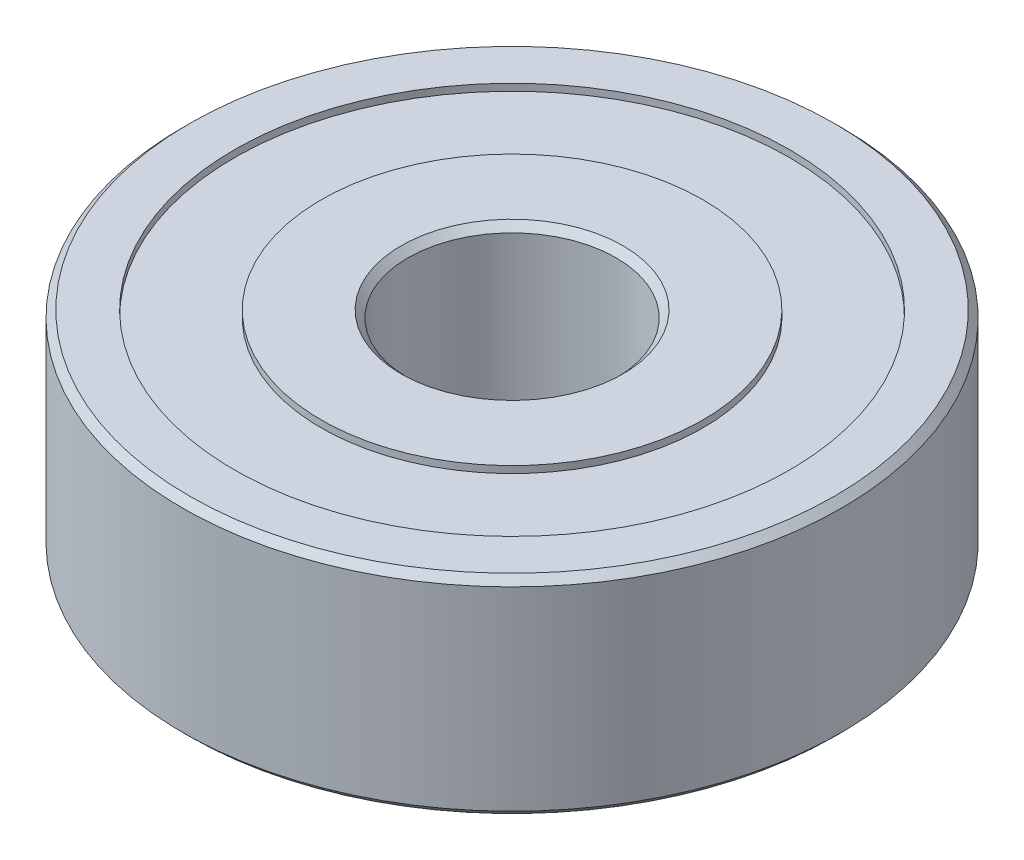
ISO-10303-21;
HEADER;
FILE_DESCRIPTION(('STEP AP214'),'2;1');
FILE_NAME('part.step','',(''),(''),'','','');
FILE_SCHEMA(('AUTOMOTIVE_DESIGN { 1 0 10303 214 1 1 1 1 }'));
ENDSEC;
DATA;
#1=APPLICATION_CONTEXT('core data for automotive mechanical design processes');
#2=APPLICATION_PROTOCOL_DEFINITION('international standard','automotive_design',2000,#1);
#3=PRODUCT_CONTEXT('',#1,'mechanical');
#4=PRODUCT('Part','Part','',(#3));
#5=PRODUCT_RELATED_PRODUCT_CATEGORY('part','',(#4));
#6=PRODUCT_DEFINITION_FORMATION('','',#4);
#7=PRODUCT_DEFINITION_CONTEXT('part definition',#1,'design');
#8=PRODUCT_DEFINITION('design','',#6,#7);
#9=PRODUCT_DEFINITION_SHAPE('','',#8);
#10=(LENGTH_UNIT() NAMED_UNIT(*) SI_UNIT(.MILLI.,.METRE.));
#11=(NAMED_UNIT(*) PLANE_ANGLE_UNIT() SI_UNIT($,.RADIAN.));
#12=(NAMED_UNIT(*) SI_UNIT($,.STERADIAN.) SOLID_ANGLE_UNIT());
#13=UNCERTAINTY_MEASURE_WITH_UNIT(LENGTH_MEASURE(1.E-05),#10,'distance_accuracy_value','');
#14=(GEOMETRIC_REPRESENTATION_CONTEXT(3) GLOBAL_UNCERTAINTY_ASSIGNED_CONTEXT((#13)) GLOBAL_UNIT_ASSIGNED_CONTEXT((#10,
#11,#12)) REPRESENTATION_CONTEXT('',''));
#15=CARTESIAN_POINT('',(0.,0.,0.));
#16=DIRECTION('',(0.,0.,1.));
#17=DIRECTION('',(1.,0.,0.));
#18=AXIS2_PLACEMENT_3D('',#15,#16,#17);
#19=CARTESIAN_POINT('',(0.,6.,0.));
#20=DIRECTION('',(0.,-1.,0.));
#21=DIRECTION('',(0.,0.,-1.));
#22=AXIS2_PLACEMENT_3D('',#19,#20,#21);
#23=CYLINDRICAL_SURFACE('',#22,9.49999999999999);
#24=CARTESIAN_POINT('',(0.,5.8,0.));
#25=DIRECTION('',(0.,-1.,0.));
#26=DIRECTION('',(0.,0.,-1.));
#27=AXIS2_PLACEMENT_3D('',#24,#25,#26);
#28=CIRCLE('',#27,9.49999999999999);
#29=CARTESIAN_POINT('',(0.,5.8,-9.49999999999999));
#30=VERTEX_POINT('',#29);
#31=EDGE_CURVE('E10',#30,#30,#28,.T.);
#32=ORIENTED_EDGE('',*,*,#31,.T.);
#33=EDGE_LOOP('',(#32));
#34=FACE_BOUND('',#33,.T.);
#35=CARTESIAN_POINT('',(0.,0.200000000000004,0.));
#36=DIRECTION('',(0.,-1.,0.));
#37=DIRECTION('',(0.,0.,-1.));
#38=AXIS2_PLACEMENT_3D('',#35,#36,#37);
#39=CIRCLE('',#38,9.5);
#40=CARTESIAN_POINT('',(0.,0.200000000000004,-9.5));
#41=VERTEX_POINT('',#40);
#42=EDGE_CURVE('E83',#41,#41,#39,.T.);
#43=ORIENTED_EDGE('',*,*,#42,.F.);
#44=EDGE_LOOP('',(#43));
#45=FACE_BOUND('',#44,.T.);
#46=ADVANCED_FACE('F31',(#34,#45),#23,.T.);
#47=CARTESIAN_POINT('',(0.,5.8,0.));
#48=DIRECTION('',(0.,-1.,0.));
#49=DIRECTION('',(0.,0.,-1.));
#50=AXIS2_PLACEMENT_3D('',#47,#48,#49);
#51=CONICAL_SURFACE('',#50,9.49999999999999,0.785398163397418);
#52=CARTESIAN_POINT('',(0.,6.,0.));
#53=DIRECTION('',(0.,-1.,0.));
#54=DIRECTION('',(0.,0.,-1.));
#55=AXIS2_PLACEMENT_3D('',#52,#53,#54);
#56=CIRCLE('',#55,9.3);
#57=CARTESIAN_POINT('',(0.,6.,-9.3));
#58=VERTEX_POINT('',#57);
#59=EDGE_CURVE('E37',#58,#58,#56,.T.);
#60=ORIENTED_EDGE('',*,*,#59,.T.);
#61=EDGE_LOOP('',(#60));
#62=FACE_BOUND('',#61,.T.);
#63=ORIENTED_EDGE('',*,*,#31,.F.);
#64=EDGE_LOOP('',(#63));
#65=FACE_BOUND('',#64,.T.);
#66=ADVANCED_FACE('F91',(#62,#65),#51,.T.);
#67=CARTESIAN_POINT('',(9.3,6.,0.));
#68=DIRECTION('',(0.,1.,0.));
#69=DIRECTION('',(0.,0.,1.));
#70=AXIS2_PLACEMENT_3D('',#67,#68,#69);
#71=PLANE('',#70);
#72=CARTESIAN_POINT('',(0.,6.,0.));
#73=DIRECTION('',(0.,-1.,0.));
#74=DIRECTION('',(0.,0.,-1.));
#75=AXIS2_PLACEMENT_3D('',#72,#73,#74);
#76=CIRCLE('',#75,8.);
#77=CARTESIAN_POINT('',(0.,6.,-8.));
#78=VERTEX_POINT('',#77);
#79=EDGE_CURVE('E41',#78,#78,#76,.T.);
#80=ORIENTED_EDGE('',*,*,#79,.T.);
#81=EDGE_LOOP('',(#80));
#82=FACE_BOUND('',#81,.T.);
#83=ORIENTED_EDGE('',*,*,#59,.F.);
#84=EDGE_LOOP('',(#83));
#85=FACE_BOUND('',#84,.T.);
#86=ADVANCED_FACE('F95',(#82,#85),#71,.T.);
#87=CARTESIAN_POINT('',(0.,6.,0.));
#88=DIRECTION('',(0.,-1.,0.));
#89=DIRECTION('',(0.,0.,-1.));
#90=AXIS2_PLACEMENT_3D('',#87,#88,#89);
#91=CYLINDRICAL_SURFACE('',#90,8.);
#92=CARTESIAN_POINT('',(0.,5.8,0.));
#93=DIRECTION('',(0.,-1.,0.));
#94=DIRECTION('',(0.,0.,-1.));
#95=AXIS2_PLACEMENT_3D('',#92,#93,#94);
#96=CIRCLE('',#95,8.);
#97=CARTESIAN_POINT('',(0.,5.8,-8.));
#98=VERTEX_POINT('',#97);
#99=EDGE_CURVE('E45',#98,#98,#96,.T.);
#100=ORIENTED_EDGE('',*,*,#99,.T.);
#101=EDGE_LOOP('',(#100));
#102=FACE_BOUND('',#101,.T.);
#103=ORIENTED_EDGE('',*,*,#79,.F.);
#104=EDGE_LOOP('',(#103));
#105=FACE_BOUND('',#104,.T.);
#106=ADVANCED_FACE('F99',(#102,#105),#91,.F.);
#107=CARTESIAN_POINT('',(8.,5.8,0.));
#108=DIRECTION('',(0.,1.,0.));
#109=DIRECTION('',(0.,0.,1.));
#110=AXIS2_PLACEMENT_3D('',#107,#108,#109);
#111=PLANE('',#110);
#112=CARTESIAN_POINT('',(0.,5.8,0.));
#113=DIRECTION('',(0.,-1.,0.));
#114=DIRECTION('',(0.,0.,-1.));
#115=AXIS2_PLACEMENT_3D('',#112,#113,#114);
#116=CIRCLE('',#115,5.5);
#117=CARTESIAN_POINT('',(0.,5.8,-5.5));
#118=VERTEX_POINT('',#117);
#119=EDGE_CURVE('E50',#118,#118,#116,.T.);
#120=ORIENTED_EDGE('',*,*,#119,.T.);
#121=EDGE_LOOP('',(#120));
#122=FACE_BOUND('',#121,.T.);
#123=ORIENTED_EDGE('',*,*,#99,.F.);
#124=EDGE_LOOP('',(#123));
#125=FACE_BOUND('',#124,.T.);
#126=ADVANCED_FACE('F106',(#122,#125),#111,.T.);
#127=CARTESIAN_POINT('',(0.,6.,0.));
#128=DIRECTION('',(0.,-1.,0.));
#129=DIRECTION('',(0.,0.,-1.));
#130=AXIS2_PLACEMENT_3D('',#127,#128,#129);
#131=CYLINDRICAL_SURFACE('',#130,5.5);
#132=CARTESIAN_POINT('',(0.,6.,0.));
#133=DIRECTION('',(0.,-1.,0.));
#134=DIRECTION('',(0.,0.,-1.));
#135=AXIS2_PLACEMENT_3D('',#132,#133,#134);
#136=CIRCLE('',#135,5.5);
#137=CARTESIAN_POINT('',(0.,6.,-5.5));
#138=VERTEX_POINT('',#137);
#139=EDGE_CURVE('E53',#138,#138,#136,.T.);
#140=ORIENTED_EDGE('',*,*,#139,.T.);
#141=EDGE_LOOP('',(#140));
#142=FACE_BOUND('',#141,.T.);
#143=ORIENTED_EDGE('',*,*,#119,.F.);
#144=EDGE_LOOP('',(#143));
#145=FACE_BOUND('',#144,.T.);
#146=ADVANCED_FACE('F110',(#142,#145),#131,.T.);
#147=CARTESIAN_POINT('',(5.5,6.,0.));
#148=DIRECTION('',(0.,1.,0.));
#149=DIRECTION('',(0.,0.,1.));
#150=AXIS2_PLACEMENT_3D('',#147,#148,#149);
#151=PLANE('',#150);
#152=CARTESIAN_POINT('',(0.,6.,0.));
#153=DIRECTION('',(0.,-1.,0.));
#154=DIRECTION('',(0.,0.,-1.));
#155=AXIS2_PLACEMENT_3D('',#152,#153,#154);
#156=CIRCLE('',#155,3.2);
#157=CARTESIAN_POINT('',(0.,6.,-3.2));
#158=VERTEX_POINT('',#157);
#159=EDGE_CURVE('E56',#158,#158,#156,.T.);
#160=ORIENTED_EDGE('',*,*,#159,.T.);
#161=EDGE_LOOP('',(#160));
#162=FACE_BOUND('',#161,.T.);
#163=ORIENTED_EDGE('',*,*,#139,.F.);
#164=EDGE_LOOP('',(#163));
#165=FACE_BOUND('',#164,.T.);
#166=ADVANCED_FACE('F114',(#162,#165),#151,.T.);
#167=CARTESIAN_POINT('',(0.,6.,0.));
#168=DIRECTION('',(0.,1.,0.));
#169=DIRECTION('',(0.,0.,1.));
#170=AXIS2_PLACEMENT_3D('',#167,#168,#169);
#171=CONICAL_SURFACE('',#170,3.2,0.785398163397449);
#172=CARTESIAN_POINT('',(0.,5.8,0.));
#173=DIRECTION('',(0.,-1.,0.));
#174=DIRECTION('',(0.,0.,-1.));
#175=AXIS2_PLACEMENT_3D('',#172,#173,#174);
#176=CIRCLE('',#175,3.);
#177=CARTESIAN_POINT('',(0.,5.8,-3.));
#178=VERTEX_POINT('',#177);
#179=EDGE_CURVE('E59',#178,#178,#176,.T.);
#180=ORIENTED_EDGE('',*,*,#179,.T.);
#181=EDGE_LOOP('',(#180));
#182=FACE_BOUND('',#181,.T.);
#183=ORIENTED_EDGE('',*,*,#159,.F.);
#184=EDGE_LOOP('',(#183));
#185=FACE_BOUND('',#184,.T.);
#186=ADVANCED_FACE('F118',(#182,#185),#171,.F.);
#187=CARTESIAN_POINT('',(0.,6.,0.));
#188=DIRECTION('',(0.,-1.,0.));
#189=DIRECTION('',(0.,0.,-1.));
#190=AXIS2_PLACEMENT_3D('',#187,#188,#189);
#191=CYLINDRICAL_SURFACE('',#190,3.);
#192=CARTESIAN_POINT('',(0.,0.2,0.));
#193=DIRECTION('',(0.,-1.,0.));
#194=DIRECTION('',(0.,0.,-1.));
#195=AXIS2_PLACEMENT_3D('',#192,#193,#194);
#196=CIRCLE('',#195,3.);
#197=CARTESIAN_POINT('',(0.,0.2,-3.));
#198=VERTEX_POINT('',#197);
#199=EDGE_CURVE('E62',#198,#198,#196,.T.);
#200=ORIENTED_EDGE('',*,*,#199,.T.);
#201=EDGE_LOOP('',(#200));
#202=FACE_BOUND('',#201,.T.);
#203=ORIENTED_EDGE('',*,*,#179,.F.);
#204=EDGE_LOOP('',(#203));
#205=FACE_BOUND('',#204,.T.);
#206=ADVANCED_FACE('F122',(#202,#205),#191,.F.);
#207=CARTESIAN_POINT('',(0.,0.2,0.));
#208=DIRECTION('',(0.,-1.,0.));
#209=DIRECTION('',(0.,0.,-1.));
#210=AXIS2_PLACEMENT_3D('',#207,#208,#209);
#211=CONICAL_SURFACE('',#210,3.,0.78539816339745);
#212=CARTESIAN_POINT('',(0.,0.,0.));
#213=DIRECTION('',(0.,-1.,0.));
#214=DIRECTION('',(0.,0.,-1.));
#215=AXIS2_PLACEMENT_3D('',#212,#213,#214);
#216=CIRCLE('',#215,3.2);
#217=CARTESIAN_POINT('',(0.,0.,-3.2));
#218=VERTEX_POINT('',#217);
#219=EDGE_CURVE('E65',#218,#218,#216,.T.);
#220=ORIENTED_EDGE('',*,*,#219,.T.);
#221=EDGE_LOOP('',(#220));
#222=FACE_BOUND('',#221,.T.);
#223=ORIENTED_EDGE('',*,*,#199,.F.);
#224=EDGE_LOOP('',(#223));
#225=FACE_BOUND('',#224,.T.);
#226=ADVANCED_FACE('F126',(#222,#225),#211,.F.);
#227=CARTESIAN_POINT('',(3.2,0.,0.));
#228=DIRECTION('',(0.,-1.,0.));
#229=DIRECTION('',(0.,0.,-1.));
#230=AXIS2_PLACEMENT_3D('',#227,#228,#229);
#231=PLANE('',#230);
#232=CARTESIAN_POINT('',(0.,0.,0.));
#233=DIRECTION('',(0.,-1.,0.));
#234=DIRECTION('',(0.,0.,-1.));
#235=AXIS2_PLACEMENT_3D('',#232,#233,#234);
#236=CIRCLE('',#235,5.5);
#237=CARTESIAN_POINT('',(0.,0.,-5.5));
#238=VERTEX_POINT('',#237);
#239=EDGE_CURVE('E68',#238,#238,#236,.T.);
#240=ORIENTED_EDGE('',*,*,#239,.T.);
#241=EDGE_LOOP('',(#240));
#242=FACE_BOUND('',#241,.T.);
#243=ORIENTED_EDGE('',*,*,#219,.F.);
#244=EDGE_LOOP('',(#243));
#245=FACE_BOUND('',#244,.T.);
#246=ADVANCED_FACE('F130',(#242,#245),#231,.T.);
#247=CARTESIAN_POINT('',(0.,6.,0.));
#248=DIRECTION('',(0.,-1.,0.));
#249=DIRECTION('',(0.,0.,-1.));
#250=AXIS2_PLACEMENT_3D('',#247,#248,#249);
#251=CYLINDRICAL_SURFACE('',#250,5.5);
#252=CARTESIAN_POINT('',(0.,0.2,0.));
#253=DIRECTION('',(0.,-1.,0.));
#254=DIRECTION('',(0.,0.,-1.));
#255=AXIS2_PLACEMENT_3D('',#252,#253,#254);
#256=CIRCLE('',#255,5.5);
#257=CARTESIAN_POINT('',(0.,0.2,-5.5));
#258=VERTEX_POINT('',#257);
#259=EDGE_CURVE('E71',#258,#258,#256,.T.);
#260=ORIENTED_EDGE('',*,*,#259,.T.);
#261=EDGE_LOOP('',(#260));
#262=FACE_BOUND('',#261,.T.);
#263=ORIENTED_EDGE('',*,*,#239,.F.);
#264=EDGE_LOOP('',(#263));
#265=FACE_BOUND('',#264,.T.);
#266=ADVANCED_FACE('F134',(#262,#265),#251,.T.);
#267=CARTESIAN_POINT('',(5.5,0.2,0.));
#268=DIRECTION('',(0.,-1.,0.));
#269=DIRECTION('',(0.,0.,-1.));
#270=AXIS2_PLACEMENT_3D('',#267,#268,#269);
#271=PLANE('',#270);
#272=CARTESIAN_POINT('',(0.,0.2,0.));
#273=DIRECTION('',(0.,-1.,0.));
#274=DIRECTION('',(0.,0.,-1.));
#275=AXIS2_PLACEMENT_3D('',#272,#273,#274);
#276=CIRCLE('',#275,8.);
#277=CARTESIAN_POINT('',(0.,0.2,-8.));
#278=VERTEX_POINT('',#277);
#279=EDGE_CURVE('E74',#278,#278,#276,.T.);
#280=ORIENTED_EDGE('',*,*,#279,.T.);
#281=EDGE_LOOP('',(#280));
#282=FACE_BOUND('',#281,.T.);
#283=ORIENTED_EDGE('',*,*,#259,.F.);
#284=EDGE_LOOP('',(#283));
#285=FACE_BOUND('',#284,.T.);
#286=ADVANCED_FACE('F138',(#282,#285),#271,.T.);
#287=CARTESIAN_POINT('',(0.,6.,0.));
#288=DIRECTION('',(0.,-1.,0.));
#289=DIRECTION('',(0.,0.,-1.));
#290=AXIS2_PLACEMENT_3D('',#287,#288,#289);
#291=CYLINDRICAL_SURFACE('',#290,8.);
#292=CARTESIAN_POINT('',(0.,0.,0.));
#293=DIRECTION('',(0.,-1.,0.));
#294=DIRECTION('',(0.,0.,-1.));
#295=AXIS2_PLACEMENT_3D('',#292,#293,#294);
#296=CIRCLE('',#295,8.);
#297=CARTESIAN_POINT('',(0.,0.,-8.));
#298=VERTEX_POINT('',#297);
#299=EDGE_CURVE('E77',#298,#298,#296,.T.);
#300=ORIENTED_EDGE('',*,*,#299,.T.);
#301=EDGE_LOOP('',(#300));
#302=FACE_BOUND('',#301,.T.);
#303=ORIENTED_EDGE('',*,*,#279,.F.);
#304=EDGE_LOOP('',(#303));
#305=FACE_BOUND('',#304,.T.);
#306=ADVANCED_FACE('F142',(#302,#305),#291,.F.);
#307=CARTESIAN_POINT('',(8.,0.,0.));
#308=DIRECTION('',(0.,-1.,0.));
#309=DIRECTION('',(0.,0.,-1.));
#310=AXIS2_PLACEMENT_3D('',#307,#308,#309);
#311=PLANE('',#310);
#312=CARTESIAN_POINT('',(0.,0.,0.));
#313=DIRECTION('',(0.,-1.,0.));
#314=DIRECTION('',(0.,0.,-1.));
#315=AXIS2_PLACEMENT_3D('',#312,#313,#314);
#316=CIRCLE('',#315,9.3);
#317=CARTESIAN_POINT('',(0.,0.,-9.3));
#318=VERTEX_POINT('',#317);
#319=EDGE_CURVE('E80',#318,#318,#316,.T.);
#320=ORIENTED_EDGE('',*,*,#319,.T.);
#321=EDGE_LOOP('',(#320));
#322=FACE_BOUND('',#321,.T.);
#323=ORIENTED_EDGE('',*,*,#299,.F.);
#324=EDGE_LOOP('',(#323));
#325=FACE_BOUND('',#324,.T.);
#326=ADVANCED_FACE('F146',(#322,#325),#311,.T.);
#327=CARTESIAN_POINT('',(0.,0.,0.));
#328=DIRECTION('',(0.,1.,0.));
#329=DIRECTION('',(0.,0.,1.));
#330=AXIS2_PLACEMENT_3D('',#327,#328,#329);
#331=CONICAL_SURFACE('',#330,9.3,0.78539816339744);
#332=ORIENTED_EDGE('',*,*,#42,.T.);
#333=EDGE_LOOP('',(#332));
#334=FACE_BOUND('',#333,.T.);
#335=ORIENTED_EDGE('',*,*,#319,.F.);
#336=EDGE_LOOP('',(#335));
#337=FACE_BOUND('',#336,.T.);
#338=ADVANCED_FACE('F87',(#334,#337),#331,.T.);
#339=CLOSED_SHELL('',(#46,#66,#86,#106,#126,#146,#166,#186,#206,#226,#246,#266,#286,#306,#326,#338));
#340=MANIFOLD_SOLID_BREP('B2',#339);
#341=ADVANCED_BREP_SHAPE_REPRESENTATION('',(#18,#340),#14);
#342=SHAPE_DEFINITION_REPRESENTATION(#9,#341);
ENDSEC;
END-ISO-10303-21;
